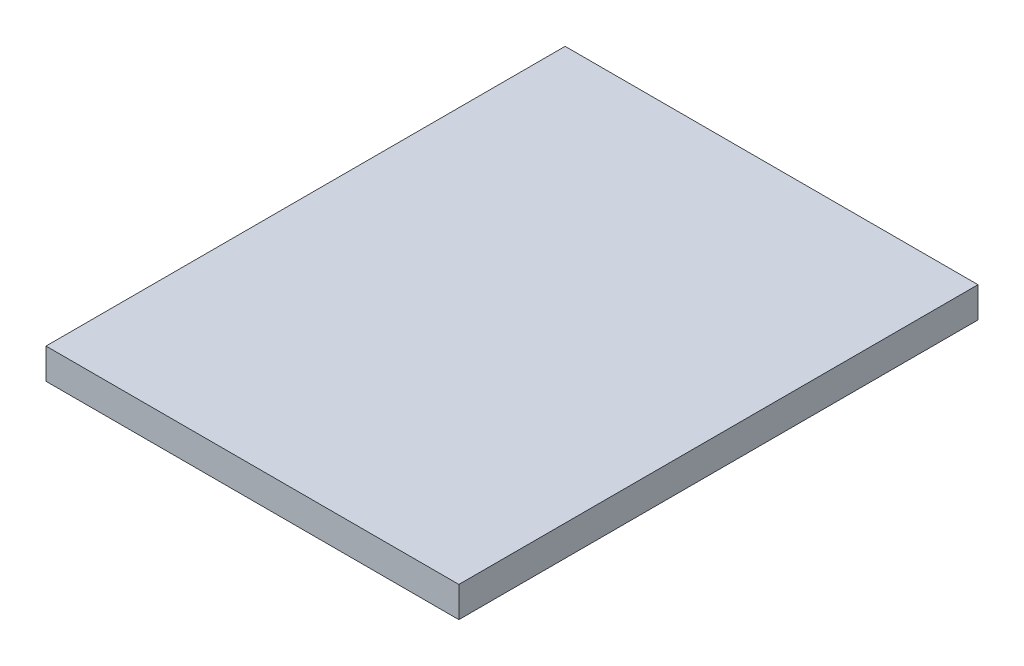
ISO-10303-21;
HEADER;
FILE_DESCRIPTION(('STEP AP214'),'2;1');
FILE_NAME('part.step','',(''),(''),'','','');
FILE_SCHEMA(('AUTOMOTIVE_DESIGN { 1 0 10303 214 1 1 1 1 }'));
ENDSEC;
DATA;
#1=APPLICATION_CONTEXT('core data for automotive mechanical design processes');
#2=APPLICATION_PROTOCOL_DEFINITION('international standard','automotive_design',2000,#1);
#3=PRODUCT_CONTEXT('',#1,'mechanical');
#4=PRODUCT('Part','Part','',(#3));
#5=PRODUCT_RELATED_PRODUCT_CATEGORY('part','',(#4));
#6=PRODUCT_DEFINITION_FORMATION('','',#4);
#7=PRODUCT_DEFINITION_CONTEXT('part definition',#1,'design');
#8=PRODUCT_DEFINITION('design','',#6,#7);
#9=PRODUCT_DEFINITION_SHAPE('','',#8);
#10=(LENGTH_UNIT() NAMED_UNIT(*) SI_UNIT(.MILLI.,.METRE.));
#11=(NAMED_UNIT(*) PLANE_ANGLE_UNIT() SI_UNIT($,.RADIAN.));
#12=(NAMED_UNIT(*) SI_UNIT($,.STERADIAN.) SOLID_ANGLE_UNIT());
#13=UNCERTAINTY_MEASURE_WITH_UNIT(LENGTH_MEASURE(1.E-05),#10,'distance_accuracy_value','');
#14=(GEOMETRIC_REPRESENTATION_CONTEXT(3) GLOBAL_UNCERTAINTY_ASSIGNED_CONTEXT((#13)) GLOBAL_UNIT_ASSIGNED_CONTEXT((#10,
#11,#12)) REPRESENTATION_CONTEXT('',''));
#15=CARTESIAN_POINT('',(0.,0.,0.));
#16=DIRECTION('',(0.,0.,1.));
#17=DIRECTION('',(1.,0.,0.));
#18=AXIS2_PLACEMENT_3D('',#15,#16,#17);
#19=CARTESIAN_POINT('',(42.926,6.35,-53.975));
#20=DIRECTION('',(-1.,0.,0.));
#21=DIRECTION('',(0.,0.,1.));
#22=AXIS2_PLACEMENT_3D('',#19,#20,#21);
#23=PLANE('',#22);
#24=DIRECTION('',(0.,0.,-1.));
#25=VECTOR('',#24,1.);
#26=CARTESIAN_POINT('',(42.926,0.,-53.975));
#27=LINE('',#26,#25);
#28=CARTESIAN_POINT('',(42.926,0.,53.975));
#29=VERTEX_POINT('',#28);
#30=CARTESIAN_POINT('',(42.926,0.,-53.975));
#31=VERTEX_POINT('',#30);
#32=EDGE_CURVE('E96',#29,#31,#27,.T.);
#33=ORIENTED_EDGE('',*,*,#32,.T.);
#34=DIRECTION('',(0.,-1.,0.));
#35=VECTOR('',#34,1.);
#36=CARTESIAN_POINT('',(42.926,6.35,-53.975));
#37=LINE('',#36,#35);
#38=CARTESIAN_POINT('',(42.926,6.35,-53.975));
#39=VERTEX_POINT('',#38);
#40=EDGE_CURVE('E11',#39,#31,#37,.T.);
#41=ORIENTED_EDGE('',*,*,#40,.F.);
#42=DIRECTION('',(0.,0.,-1.));
#43=VECTOR('',#42,1.);
#44=CARTESIAN_POINT('',(42.926,6.35,-53.975));
#45=LINE('',#44,#43);
#46=CARTESIAN_POINT('',(42.926,6.35,53.975));
#47=VERTEX_POINT('',#46);
#48=EDGE_CURVE('E84',#47,#39,#45,.T.);
#49=ORIENTED_EDGE('',*,*,#48,.F.);
#50=DIRECTION('',(0.,-1.,0.));
#51=VECTOR('',#50,1.);
#52=CARTESIAN_POINT('',(42.926,6.35,53.975));
#53=LINE('',#52,#51);
#54=EDGE_CURVE('E92',#47,#29,#53,.T.);
#55=ORIENTED_EDGE('',*,*,#54,.T.);
#56=EDGE_LOOP('',(#33,#41,#49,#55));
#57=FACE_BOUND('',#56,.T.);
#58=ADVANCED_FACE('F33',(#57),#23,.F.);
#59=CARTESIAN_POINT('',(-42.926,6.35,-53.975));
#60=DIRECTION('',(0.,0.,1.));
#61=DIRECTION('',(1.,0.,0.));
#62=AXIS2_PLACEMENT_3D('',#59,#60,#61);
#63=PLANE('',#62);
#64=DIRECTION('',(-1.,0.,0.));
#65=VECTOR('',#64,1.);
#66=CARTESIAN_POINT('',(-42.926,0.,-53.975));
#67=LINE('',#66,#65);
#68=CARTESIAN_POINT('',(-42.926,0.,-53.975));
#69=VERTEX_POINT('',#68);
#70=EDGE_CURVE('E88',#31,#69,#67,.T.);
#71=ORIENTED_EDGE('',*,*,#70,.T.);
#72=DIRECTION('',(0.,-1.,0.));
#73=VECTOR('',#72,1.);
#74=CARTESIAN_POINT('',(-42.926,6.35,-53.975));
#75=LINE('',#74,#73);
#76=CARTESIAN_POINT('',(-42.926,6.35,-53.975));
#77=VERTEX_POINT('',#76);
#78=EDGE_CURVE('E41',#77,#69,#75,.T.);
#79=ORIENTED_EDGE('',*,*,#78,.F.);
#80=DIRECTION('',(-1.,0.,0.));
#81=VECTOR('',#80,1.);
#82=CARTESIAN_POINT('',(-42.926,6.35,-53.975));
#83=LINE('',#82,#81);
#84=EDGE_CURVE('E79',#39,#77,#83,.T.);
#85=ORIENTED_EDGE('',*,*,#84,.F.);
#86=ORIENTED_EDGE('',*,*,#40,.T.);
#87=EDGE_LOOP('',(#71,#79,#85,#86));
#88=FACE_BOUND('',#87,.T.);
#89=ADVANCED_FACE('F87',(#88),#63,.F.);
#90=CARTESIAN_POINT('',(-42.926,6.35,-53.975));
#91=DIRECTION('',(1.,0.,0.));
#92=DIRECTION('',(0.,0.,-1.));
#93=AXIS2_PLACEMENT_3D('',#90,#91,#92);
#94=PLANE('',#93);
#95=DIRECTION('',(0.,0.,1.));
#96=VECTOR('',#95,1.);
#97=CARTESIAN_POINT('',(-42.926,0.,-53.975));
#98=LINE('',#97,#96);
#99=CARTESIAN_POINT('',(-42.926,0.,53.975));
#100=VERTEX_POINT('',#99);
#101=EDGE_CURVE('E66',#69,#100,#98,.T.);
#102=ORIENTED_EDGE('',*,*,#101,.T.);
#103=DIRECTION('',(0.,-1.,0.));
#104=VECTOR('',#103,1.);
#105=CARTESIAN_POINT('',(-42.926,6.35,53.975));
#106=LINE('',#105,#104);
#107=CARTESIAN_POINT('',(-42.926,6.35,53.975));
#108=VERTEX_POINT('',#107);
#109=EDGE_CURVE('E89',#108,#100,#106,.T.);
#110=ORIENTED_EDGE('',*,*,#109,.F.);
#111=DIRECTION('',(0.,0.,1.));
#112=VECTOR('',#111,1.);
#113=CARTESIAN_POINT('',(-42.926,6.35,-53.975));
#114=LINE('',#113,#112);
#115=EDGE_CURVE('E82',#77,#108,#114,.T.);
#116=ORIENTED_EDGE('',*,*,#115,.F.);
#117=ORIENTED_EDGE('',*,*,#78,.T.);
#118=EDGE_LOOP('',(#102,#110,#116,#117));
#119=FACE_BOUND('',#118,.T.);
#120=ADVANCED_FACE('F90',(#119),#94,.F.);
#121=CARTESIAN_POINT('',(-42.926,6.35,53.975));
#122=DIRECTION('',(0.,0.,-1.));
#123=DIRECTION('',(-1.,0.,0.));
#124=AXIS2_PLACEMENT_3D('',#121,#122,#123);
#125=PLANE('',#124);
#126=DIRECTION('',(1.,0.,0.));
#127=VECTOR('',#126,1.);
#128=CARTESIAN_POINT('',(-42.926,0.,53.975));
#129=LINE('',#128,#127);
#130=EDGE_CURVE('E72',#100,#29,#129,.T.);
#131=ORIENTED_EDGE('',*,*,#130,.T.);
#132=ORIENTED_EDGE('',*,*,#54,.F.);
#133=DIRECTION('',(1.,0.,0.));
#134=VECTOR('',#133,1.);
#135=CARTESIAN_POINT('',(-42.926,6.35,53.975));
#136=LINE('',#135,#134);
#137=EDGE_CURVE('E49',#108,#47,#136,.T.);
#138=ORIENTED_EDGE('',*,*,#137,.F.);
#139=ORIENTED_EDGE('',*,*,#109,.T.);
#140=EDGE_LOOP('',(#131,#132,#138,#139));
#141=FACE_BOUND('',#140,.T.);
#142=ADVANCED_FACE('F103',(#141),#125,.F.);
#143=CARTESIAN_POINT('',(0.,6.35,0.));
#144=DIRECTION('',(0.,1.,0.));
#145=DIRECTION('',(0.,0.,1.));
#146=AXIS2_PLACEMENT_3D('',#143,#144,#145);
#147=PLANE('',#146);
#148=ORIENTED_EDGE('',*,*,#48,.T.);
#149=ORIENTED_EDGE('',*,*,#84,.T.);
#150=ORIENTED_EDGE('',*,*,#115,.T.);
#151=ORIENTED_EDGE('',*,*,#137,.T.);
#152=EDGE_LOOP('',(#148,#149,#150,#151));
#153=FACE_BOUND('',#152,.T.);
#154=ADVANCED_FACE('F80',(#153),#147,.T.);
#155=CARTESIAN_POINT('',(0.,0.,0.));
#156=DIRECTION('',(0.,1.,0.));
#157=DIRECTION('',(0.,0.,1.));
#158=AXIS2_PLACEMENT_3D('',#155,#156,#157);
#159=PLANE('',#158);
#160=ORIENTED_EDGE('',*,*,#32,.F.);
#161=ORIENTED_EDGE('',*,*,#130,.F.);
#162=ORIENTED_EDGE('',*,*,#101,.F.);
#163=ORIENTED_EDGE('',*,*,#70,.F.);
#164=EDGE_LOOP('',(#160,#161,#162,#163));
#165=FACE_BOUND('',#164,.T.);
#166=ADVANCED_FACE('F106',(#165),#159,.F.);
#167=CLOSED_SHELL('',(#58,#89,#120,#142,#154,#166));
#168=MANIFOLD_SOLID_BREP('B2',#167);
#169=ADVANCED_BREP_SHAPE_REPRESENTATION('',(#18,#168),#14);
#170=SHAPE_DEFINITION_REPRESENTATION(#9,#169);
ENDSEC;
END-ISO-10303-21;
